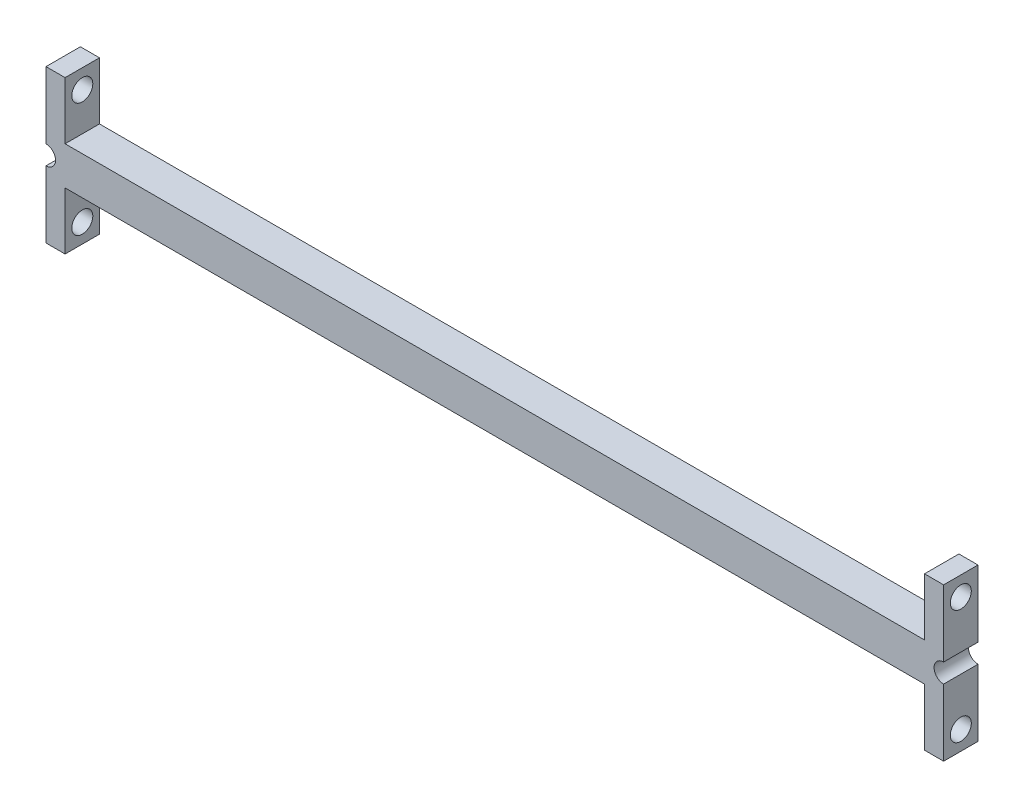
ISO-10303-21;
HEADER;
FILE_DESCRIPTION(('STEP AP214'),'2;1');
FILE_NAME('part.step','',(''),(''),'','','');
FILE_SCHEMA(('AUTOMOTIVE_DESIGN { 1 0 10303 214 1 1 1 1 }'));
ENDSEC;
DATA;
#1=APPLICATION_CONTEXT('core data for automotive mechanical design processes');
#2=APPLICATION_PROTOCOL_DEFINITION('international standard','automotive_design',2000,#1);
#3=PRODUCT_CONTEXT('',#1,'mechanical');
#4=PRODUCT('Part','Part','',(#3));
#5=PRODUCT_RELATED_PRODUCT_CATEGORY('part','',(#4));
#6=PRODUCT_DEFINITION_FORMATION('','',#4);
#7=PRODUCT_DEFINITION_CONTEXT('part definition',#1,'design');
#8=PRODUCT_DEFINITION('design','',#6,#7);
#9=PRODUCT_DEFINITION_SHAPE('','',#8);
#10=(LENGTH_UNIT() NAMED_UNIT(*) SI_UNIT(.MILLI.,.METRE.));
#11=(NAMED_UNIT(*) PLANE_ANGLE_UNIT() SI_UNIT($,.RADIAN.));
#12=(NAMED_UNIT(*) SI_UNIT($,.STERADIAN.) SOLID_ANGLE_UNIT());
#13=UNCERTAINTY_MEASURE_WITH_UNIT(LENGTH_MEASURE(1.E-05),#10,'distance_accuracy_value','');
#14=(GEOMETRIC_REPRESENTATION_CONTEXT(3) GLOBAL_UNCERTAINTY_ASSIGNED_CONTEXT((#13)) GLOBAL_UNIT_ASSIGNED_CONTEXT((#10,
#11,#12)) REPRESENTATION_CONTEXT('',''));
#15=CARTESIAN_POINT('',(0.,0.,0.));
#16=DIRECTION('',(0.,0.,1.));
#17=DIRECTION('',(1.,0.,0.));
#18=AXIS2_PLACEMENT_3D('',#15,#16,#17);
#19=CARTESIAN_POINT('',(0.,0.,9.));
#20=DIRECTION('',(1.,0.,0.));
#21=DIRECTION('',(0.,1.,0.));
#22=AXIS2_PLACEMENT_3D('',#19,#20,#21);
#23=PLANE('',#22);
#24=CARTESIAN_POINT('',(0.,10.,4.5));
#25=DIRECTION('',(-1.,0.,0.));
#26=DIRECTION('',(0.,-1.,0.));
#27=AXIS2_PLACEMENT_3D('',#24,#25,#26);
#28=CIRCLE('',#27,2.75);
#29=CARTESIAN_POINT('',(0.,7.25,4.5));
#30=VERTEX_POINT('',#29);
#31=EDGE_CURVE('E204',#30,#30,#28,.T.);
#32=ORIENTED_EDGE('',*,*,#31,.F.);
#33=EDGE_LOOP('',(#32));
#34=FACE_BOUND('',#33,.T.);
#35=DIRECTION('',(0.,-1.,0.));
#36=VECTOR('',#35,1.);
#37=CARTESIAN_POINT('',(0.,0.,0.));
#38=LINE('',#37,#36);
#39=CARTESIAN_POINT('',(0.,15.,0.));
#40=VERTEX_POINT('',#39);
#41=CARTESIAN_POINT('',(0.,-2.5,0.));
#42=VERTEX_POINT('',#41);
#43=EDGE_CURVE('E161',#40,#42,#38,.T.);
#44=ORIENTED_EDGE('',*,*,#43,.T.);
#45=DIRECTION('',(0.,0.,1.));
#46=VECTOR('',#45,1.);
#47=CARTESIAN_POINT('',(0.,-2.5,-23.));
#48=LINE('',#47,#46);
#49=CARTESIAN_POINT('',(0.,-2.5,9.));
#50=VERTEX_POINT('',#49);
#51=EDGE_CURVE('E58',#42,#50,#48,.T.);
#52=ORIENTED_EDGE('',*,*,#51,.T.);
#53=DIRECTION('',(0.,-1.,0.));
#54=VECTOR('',#53,1.);
#55=CARTESIAN_POINT('',(0.,0.,9.));
#56=LINE('',#55,#54);
#57=CARTESIAN_POINT('',(0.,15.,9.));
#58=VERTEX_POINT('',#57);
#59=EDGE_CURVE('E159',#58,#50,#56,.T.);
#60=ORIENTED_EDGE('',*,*,#59,.F.);
#61=DIRECTION('',(0.,0.,1.));
#62=VECTOR('',#61,1.);
#63=CARTESIAN_POINT('',(0.,15.,0.));
#64=LINE('',#63,#62);
#65=EDGE_CURVE('E241',#40,#58,#64,.T.);
#66=ORIENTED_EDGE('',*,*,#65,.F.);
#67=EDGE_LOOP('',(#44,#52,#60,#66));
#68=FACE_BOUND('',#67,.T.);
#69=ADVANCED_FACE('F34',(#34,#68),#23,.F.);
#70=CARTESIAN_POINT('',(235.,0.,9.));
#71=DIRECTION('',(-1.,0.,0.));
#72=DIRECTION('',(0.,0.,1.));
#73=AXIS2_PLACEMENT_3D('',#70,#71,#72);
#74=PLANE('',#73);
#75=CARTESIAN_POINT('',(235.,-20.,4.5));
#76=DIRECTION('',(-1.,0.,0.));
#77=DIRECTION('',(0.,-1.,0.));
#78=AXIS2_PLACEMENT_3D('',#75,#76,#77);
#79=CIRCLE('',#78,2.75);
#80=CARTESIAN_POINT('',(235.,-22.75,4.5));
#81=VERTEX_POINT('',#80);
#82=EDGE_CURVE('E214',#81,#81,#79,.T.);
#83=ORIENTED_EDGE('',*,*,#82,.T.);
#84=EDGE_LOOP('',(#83));
#85=FACE_BOUND('',#84,.T.);
#86=DIRECTION('',(0.,1.,0.));
#87=VECTOR('',#86,1.);
#88=CARTESIAN_POINT('',(235.,0.,0.));
#89=LINE('',#88,#87);
#90=CARTESIAN_POINT('',(235.,-25.,0.));
#91=VERTEX_POINT('',#90);
#92=CARTESIAN_POINT('',(235.,-7.49999999999999,0.));
#93=VERTEX_POINT('',#92);
#94=EDGE_CURVE('E190',#91,#93,#89,.T.);
#95=ORIENTED_EDGE('',*,*,#94,.T.);
#96=DIRECTION('',(0.,0.,1.));
#97=VECTOR('',#96,1.);
#98=CARTESIAN_POINT('',(235.,-7.49999999999999,-23.));
#99=LINE('',#98,#97);
#100=CARTESIAN_POINT('',(235.,-7.49999999999999,9.));
#101=VERTEX_POINT('',#100);
#102=EDGE_CURVE('E51',#93,#101,#99,.T.);
#103=ORIENTED_EDGE('',*,*,#102,.T.);
#104=DIRECTION('',(0.,1.,0.));
#105=VECTOR('',#104,1.);
#106=CARTESIAN_POINT('',(235.,0.,9.));
#107=LINE('',#106,#105);
#108=CARTESIAN_POINT('',(235.,-25.,9.));
#109=VERTEX_POINT('',#108);
#110=EDGE_CURVE('E179',#109,#101,#107,.T.);
#111=ORIENTED_EDGE('',*,*,#110,.F.);
#112=DIRECTION('',(0.,0.,1.));
#113=VECTOR('',#112,1.);
#114=CARTESIAN_POINT('',(235.,-25.,0.));
#115=LINE('',#114,#113);
#116=EDGE_CURVE('E281',#91,#109,#115,.T.);
#117=ORIENTED_EDGE('',*,*,#116,.F.);
#118=EDGE_LOOP('',(#95,#103,#111,#117));
#119=FACE_BOUND('',#118,.T.);
#120=ADVANCED_FACE('F323',(#85,#119),#74,.F.);
#121=CARTESIAN_POINT('',(0.,-20.,4.5));
#122=DIRECTION('',(-1.,0.,0.));
#123=DIRECTION('',(0.,-1.,0.));
#124=AXIS2_PLACEMENT_3D('',#121,#122,#123);
#125=CIRCLE('',#124,2.75);
#126=CARTESIAN_POINT('',(0.,-22.75,4.5));
#127=VERTEX_POINT('',#126);
#128=EDGE_CURVE('E209',#127,#127,#125,.T.);
#129=ORIENTED_EDGE('',*,*,#128,.F.);
#130=EDGE_LOOP('',(#129));
#131=FACE_BOUND('',#130,.T.);
#132=CARTESIAN_POINT('',(0.,-7.5,9.));
#133=VERTEX_POINT('',#132);
#134=CARTESIAN_POINT('',(0.,-25.,9.));
#135=VERTEX_POINT('',#134);
#136=EDGE_CURVE('E170',#133,#135,#56,.T.);
#137=ORIENTED_EDGE('',*,*,#136,.F.);
#138=DIRECTION('',(0.,0.,1.));
#139=VECTOR('',#138,1.);
#140=CARTESIAN_POINT('',(0.,-7.5,-23.));
#141=LINE('',#140,#139);
#142=CARTESIAN_POINT('',(0.,-7.5,0.));
#143=VERTEX_POINT('',#142);
#144=EDGE_CURVE('E149',#133,#143,#141,.F.);
#145=ORIENTED_EDGE('',*,*,#144,.T.);
#146=CARTESIAN_POINT('',(0.,-25.,0.));
#147=VERTEX_POINT('',#146);
#148=EDGE_CURVE('E187',#143,#147,#38,.T.);
#149=ORIENTED_EDGE('',*,*,#148,.T.);
#150=DIRECTION('',(0.,0.,1.));
#151=VECTOR('',#150,1.);
#152=CARTESIAN_POINT('',(0.,-25.,0.));
#153=LINE('',#152,#151);
#154=EDGE_CURVE('E234',#147,#135,#153,.T.);
#155=ORIENTED_EDGE('',*,*,#154,.T.);
#156=EDGE_LOOP('',(#137,#145,#149,#155));
#157=FACE_BOUND('',#156,.T.);
#158=ADVANCED_FACE('F36',(#131,#157),#23,.F.);
#159=CARTESIAN_POINT('',(0.,-10.,9.));
#160=DIRECTION('',(0.,1.,0.));
#161=DIRECTION('',(-1.,0.,0.));
#162=AXIS2_PLACEMENT_3D('',#159,#160,#161);
#163=PLANE('',#162);
#164=DIRECTION('',(1.,0.,0.));
#165=VECTOR('',#164,1.);
#166=CARTESIAN_POINT('',(0.,-10.,9.));
#167=LINE('',#166,#165);
#168=CARTESIAN_POINT('',(5.,-10.,9.));
#169=VERTEX_POINT('',#168);
#170=CARTESIAN_POINT('',(230.,-10.,9.));
#171=VERTEX_POINT('',#170);
#172=EDGE_CURVE('E169',#169,#171,#167,.T.);
#173=ORIENTED_EDGE('',*,*,#172,.F.);
#174=DIRECTION('',(0.,0.,-1.));
#175=VECTOR('',#174,1.);
#176=CARTESIAN_POINT('',(5.,-10.,9.));
#177=LINE('',#176,#175);
#178=CARTESIAN_POINT('',(5.,-10.,0.));
#179=VERTEX_POINT('',#178);
#180=EDGE_CURVE('E253',#169,#179,#177,.T.);
#181=ORIENTED_EDGE('',*,*,#180,.T.);
#182=DIRECTION('',(1.,0.,0.));
#183=VECTOR('',#182,1.);
#184=CARTESIAN_POINT('',(0.,-10.,0.));
#185=LINE('',#184,#183);
#186=CARTESIAN_POINT('',(230.,-10.,0.));
#187=VERTEX_POINT('',#186);
#188=EDGE_CURVE('E186',#179,#187,#185,.T.);
#189=ORIENTED_EDGE('',*,*,#188,.T.);
#190=DIRECTION('',(0.,0.,1.));
#191=VECTOR('',#190,1.);
#192=CARTESIAN_POINT('',(230.,-10.,9.));
#193=LINE('',#192,#191);
#194=EDGE_CURVE('E176',#187,#171,#193,.T.);
#195=ORIENTED_EDGE('',*,*,#194,.T.);
#196=EDGE_LOOP('',(#173,#181,#189,#195));
#197=FACE_BOUND('',#196,.T.);
#198=ADVANCED_FACE('F311',(#197),#163,.F.);
#199=CARTESIAN_POINT('',(235.,10.,4.5));
#200=DIRECTION('',(-1.,0.,0.));
#201=DIRECTION('',(0.,-1.,0.));
#202=AXIS2_PLACEMENT_3D('',#199,#200,#201);
#203=CIRCLE('',#202,2.75);
#204=CARTESIAN_POINT('',(235.,7.25000000000003,4.5));
#205=VERTEX_POINT('',#204);
#206=EDGE_CURVE('E198',#205,#205,#203,.T.);
#207=ORIENTED_EDGE('',*,*,#206,.T.);
#208=EDGE_LOOP('',(#207));
#209=FACE_BOUND('',#208,.T.);
#210=CARTESIAN_POINT('',(235.,-2.5,9.));
#211=VERTEX_POINT('',#210);
#212=CARTESIAN_POINT('',(235.,15.,9.));
#213=VERTEX_POINT('',#212);
#214=EDGE_CURVE('E172',#211,#213,#107,.T.);
#215=ORIENTED_EDGE('',*,*,#214,.F.);
#216=DIRECTION('',(0.,0.,1.));
#217=VECTOR('',#216,1.);
#218=CARTESIAN_POINT('',(235.,-2.5,-23.));
#219=LINE('',#218,#217);
#220=CARTESIAN_POINT('',(235.,-2.5,0.));
#221=VERTEX_POINT('',#220);
#222=EDGE_CURVE('E162',#211,#221,#219,.F.);
#223=ORIENTED_EDGE('',*,*,#222,.T.);
#224=CARTESIAN_POINT('',(235.,15.,0.));
#225=VERTEX_POINT('',#224);
#226=EDGE_CURVE('E189',#221,#225,#89,.T.);
#227=ORIENTED_EDGE('',*,*,#226,.T.);
#228=DIRECTION('',(0.,0.,1.));
#229=VECTOR('',#228,1.);
#230=CARTESIAN_POINT('',(235.,15.,0.));
#231=LINE('',#230,#229);
#232=EDGE_CURVE('E278',#225,#213,#231,.T.);
#233=ORIENTED_EDGE('',*,*,#232,.T.);
#234=EDGE_LOOP('',(#215,#223,#227,#233));
#235=FACE_BOUND('',#234,.T.);
#236=ADVANCED_FACE('F327',(#209,#235),#74,.F.);
#237=CARTESIAN_POINT('',(0.,0.,9.));
#238=DIRECTION('',(0.,-1.,0.));
#239=DIRECTION('',(0.,0.,-1.));
#240=AXIS2_PLACEMENT_3D('',#237,#238,#239);
#241=PLANE('',#240);
#242=DIRECTION('',(-1.,0.,0.));
#243=VECTOR('',#242,1.);
#244=CARTESIAN_POINT('',(0.,0.,0.));
#245=LINE('',#244,#243);
#246=CARTESIAN_POINT('',(230.,0.,0.));
#247=VERTEX_POINT('',#246);
#248=CARTESIAN_POINT('',(5.,0.,0.));
#249=VERTEX_POINT('',#248);
#250=EDGE_CURVE('E174',#247,#249,#245,.T.);
#251=ORIENTED_EDGE('',*,*,#250,.T.);
#252=DIRECTION('',(0.,0.,1.));
#253=VECTOR('',#252,1.);
#254=CARTESIAN_POINT('',(5.,0.,9.));
#255=LINE('',#254,#253);
#256=CARTESIAN_POINT('',(5.,0.,9.));
#257=VERTEX_POINT('',#256);
#258=EDGE_CURVE('E243',#249,#257,#255,.T.);
#259=ORIENTED_EDGE('',*,*,#258,.T.);
#260=DIRECTION('',(-1.,0.,0.));
#261=VECTOR('',#260,1.);
#262=CARTESIAN_POINT('',(0.,0.,9.));
#263=LINE('',#262,#261);
#264=CARTESIAN_POINT('',(230.,0.,9.));
#265=VERTEX_POINT('',#264);
#266=EDGE_CURVE('E182',#265,#257,#263,.T.);
#267=ORIENTED_EDGE('',*,*,#266,.F.);
#268=DIRECTION('',(0.,0.,-1.));
#269=VECTOR('',#268,1.);
#270=CARTESIAN_POINT('',(230.,0.,9.));
#271=LINE('',#270,#269);
#272=EDGE_CURVE('E277',#265,#247,#271,.T.);
#273=ORIENTED_EDGE('',*,*,#272,.T.);
#274=EDGE_LOOP('',(#251,#259,#267,#273));
#275=FACE_BOUND('',#274,.T.);
#276=ADVANCED_FACE('F336',(#275),#241,.F.);
#277=CARTESIAN_POINT('',(0.,0.,9.));
#278=DIRECTION('',(0.,0.,1.));
#279=DIRECTION('',(1.,0.,0.));
#280=AXIS2_PLACEMENT_3D('',#277,#278,#279);
#281=PLANE('',#280);
#282=CARTESIAN_POINT('',(235.,-5.,9.));
#283=DIRECTION('',(0.,0.,1.));
#284=DIRECTION('',(1.,0.,0.));
#285=AXIS2_PLACEMENT_3D('',#282,#283,#284);
#286=CIRCLE('',#285,2.5);
#287=EDGE_CURVE('E153',#211,#101,#286,.T.);
#288=ORIENTED_EDGE('',*,*,#287,.F.);
#289=ORIENTED_EDGE('',*,*,#214,.T.);
#290=DIRECTION('',(-1.,0.,0.));
#291=VECTOR('',#290,1.);
#292=CARTESIAN_POINT('',(230.,15.,9.));
#293=LINE('',#292,#291);
#294=CARTESIAN_POINT('',(230.,15.,9.));
#295=VERTEX_POINT('',#294);
#296=EDGE_CURVE('E272',#213,#295,#293,.T.);
#297=ORIENTED_EDGE('',*,*,#296,.T.);
#298=DIRECTION('',(0.,-1.,0.));
#299=VECTOR('',#298,1.);
#300=CARTESIAN_POINT('',(230.,15.,9.));
#301=LINE('',#300,#299);
#302=EDGE_CURVE('E267',#295,#265,#301,.T.);
#303=ORIENTED_EDGE('',*,*,#302,.T.);
#304=ORIENTED_EDGE('',*,*,#266,.T.);
#305=DIRECTION('',(0.,1.,0.));
#306=VECTOR('',#305,1.);
#307=CARTESIAN_POINT('',(5.,15.,9.));
#308=LINE('',#307,#306);
#309=CARTESIAN_POINT('',(5.,15.,9.));
#310=VERTEX_POINT('',#309);
#311=EDGE_CURVE('E237',#257,#310,#308,.T.);
#312=ORIENTED_EDGE('',*,*,#311,.T.);
#313=DIRECTION('',(-1.,0.,0.));
#314=VECTOR('',#313,1.);
#315=CARTESIAN_POINT('',(0.,15.,9.));
#316=LINE('',#315,#314);
#317=EDGE_CURVE('E168',#310,#58,#316,.T.);
#318=ORIENTED_EDGE('',*,*,#317,.T.);
#319=ORIENTED_EDGE('',*,*,#59,.T.);
#320=CARTESIAN_POINT('',(0.,-5.,9.));
#321=DIRECTION('',(0.,0.,1.));
#322=DIRECTION('',(1.,0.,0.));
#323=AXIS2_PLACEMENT_3D('',#320,#321,#322);
#324=CIRCLE('',#323,2.5);
#325=EDGE_CURVE('E146',#133,#50,#324,.T.);
#326=ORIENTED_EDGE('',*,*,#325,.F.);
#327=ORIENTED_EDGE('',*,*,#136,.T.);
#328=DIRECTION('',(1.,0.,0.));
#329=VECTOR('',#328,1.);
#330=CARTESIAN_POINT('',(0.,-25.,9.));
#331=LINE('',#330,#329);
#332=CARTESIAN_POINT('',(5.00000000000001,-25.,9.));
#333=VERTEX_POINT('',#332);
#334=EDGE_CURVE('E224',#135,#333,#331,.T.);
#335=ORIENTED_EDGE('',*,*,#334,.T.);
#336=EDGE_CURVE('E238',#333,#169,#308,.T.);
#337=ORIENTED_EDGE('',*,*,#336,.T.);
#338=ORIENTED_EDGE('',*,*,#172,.T.);
#339=CARTESIAN_POINT('',(230.,-25.,9.));
#340=VERTEX_POINT('',#339);
#341=EDGE_CURVE('E256',#171,#340,#301,.T.);
#342=ORIENTED_EDGE('',*,*,#341,.T.);
#343=DIRECTION('',(1.,0.,0.));
#344=VECTOR('',#343,1.);
#345=CARTESIAN_POINT('',(230.,-25.,9.));
#346=LINE('',#345,#344);
#347=EDGE_CURVE('E269',#340,#109,#346,.T.);
#348=ORIENTED_EDGE('',*,*,#347,.T.);
#349=ORIENTED_EDGE('',*,*,#110,.T.);
#350=EDGE_LOOP('',(#288,#289,#297,#303,#304,#312,#318,#319,#326,#327,#335,#337,#338,#342,#348,#349));
#351=FACE_BOUND('',#350,.T.);
#352=ADVANCED_FACE('F166',(#351),#281,.T.);
#353=CARTESIAN_POINT('',(0.,0.,0.));
#354=DIRECTION('',(0.,0.,1.));
#355=DIRECTION('',(1.,0.,0.));
#356=AXIS2_PLACEMENT_3D('',#353,#354,#355);
#357=PLANE('',#356);
#358=ORIENTED_EDGE('',*,*,#226,.F.);
#359=CARTESIAN_POINT('',(235.,-5.,0.));
#360=DIRECTION('',(0.,0.,1.));
#361=DIRECTION('',(1.,0.,0.));
#362=AXIS2_PLACEMENT_3D('',#359,#360,#361);
#363=CIRCLE('',#362,2.5);
#364=EDGE_CURVE('E11',#221,#93,#363,.T.);
#365=ORIENTED_EDGE('',*,*,#364,.T.);
#366=ORIENTED_EDGE('',*,*,#94,.F.);
#367=DIRECTION('',(1.,0.,0.));
#368=VECTOR('',#367,1.);
#369=CARTESIAN_POINT('',(230.,-25.,0.));
#370=LINE('',#369,#368);
#371=CARTESIAN_POINT('',(230.,-25.,0.));
#372=VERTEX_POINT('',#371);
#373=EDGE_CURVE('E259',#372,#91,#370,.T.);
#374=ORIENTED_EDGE('',*,*,#373,.F.);
#375=DIRECTION('',(0.,-1.,0.));
#376=VECTOR('',#375,1.);
#377=CARTESIAN_POINT('',(230.,15.,0.));
#378=LINE('',#377,#376);
#379=EDGE_CURVE('E260',#187,#372,#378,.T.);
#380=ORIENTED_EDGE('',*,*,#379,.F.);
#381=ORIENTED_EDGE('',*,*,#188,.F.);
#382=DIRECTION('',(0.,1.,0.));
#383=VECTOR('',#382,1.);
#384=CARTESIAN_POINT('',(5.,15.,0.));
#385=LINE('',#384,#383);
#386=CARTESIAN_POINT('',(5.00000000000001,-25.,0.));
#387=VERTEX_POINT('',#386);
#388=EDGE_CURVE('E229',#387,#179,#385,.T.);
#389=ORIENTED_EDGE('',*,*,#388,.F.);
#390=DIRECTION('',(1.,0.,0.));
#391=VECTOR('',#390,1.);
#392=CARTESIAN_POINT('',(0.,-25.,0.));
#393=LINE('',#392,#391);
#394=EDGE_CURVE('E225',#147,#387,#393,.T.);
#395=ORIENTED_EDGE('',*,*,#394,.F.);
#396=ORIENTED_EDGE('',*,*,#148,.F.);
#397=CARTESIAN_POINT('',(0.,-5.,0.));
#398=DIRECTION('',(0.,0.,1.));
#399=DIRECTION('',(1.,0.,0.));
#400=AXIS2_PLACEMENT_3D('',#397,#398,#399);
#401=CIRCLE('',#400,2.5);
#402=EDGE_CURVE('E43',#143,#42,#401,.T.);
#403=ORIENTED_EDGE('',*,*,#402,.T.);
#404=ORIENTED_EDGE('',*,*,#43,.F.);
#405=DIRECTION('',(-1.,0.,0.));
#406=VECTOR('',#405,1.);
#407=CARTESIAN_POINT('',(0.,15.,0.));
#408=LINE('',#407,#406);
#409=CARTESIAN_POINT('',(5.,15.,0.));
#410=VERTEX_POINT('',#409);
#411=EDGE_CURVE('E231',#410,#40,#408,.T.);
#412=ORIENTED_EDGE('',*,*,#411,.F.);
#413=EDGE_CURVE('E228',#249,#410,#385,.T.);
#414=ORIENTED_EDGE('',*,*,#413,.F.);
#415=ORIENTED_EDGE('',*,*,#250,.F.);
#416=CARTESIAN_POINT('',(230.,15.,0.));
#417=VERTEX_POINT('',#416);
#418=EDGE_CURVE('E257',#417,#247,#378,.T.);
#419=ORIENTED_EDGE('',*,*,#418,.F.);
#420=DIRECTION('',(-1.,0.,0.));
#421=VECTOR('',#420,1.);
#422=CARTESIAN_POINT('',(230.,15.,0.));
#423=LINE('',#422,#421);
#424=EDGE_CURVE('E263',#225,#417,#423,.T.);
#425=ORIENTED_EDGE('',*,*,#424,.F.);
#426=EDGE_LOOP('',(#358,#365,#366,#374,#380,#381,#389,#395,#396,#403,#404,#412,#414,#415,#419,#425));
#427=FACE_BOUND('',#426,.T.);
#428=ADVANCED_FACE('F304',(#427),#357,.F.);
#429=CARTESIAN_POINT('',(230.,15.,0.));
#430=DIRECTION('',(0.,1.,0.));
#431=DIRECTION('',(0.,0.,1.));
#432=AXIS2_PLACEMENT_3D('',#429,#430,#431);
#433=PLANE('',#432);
#434=ORIENTED_EDGE('',*,*,#296,.F.);
#435=ORIENTED_EDGE('',*,*,#232,.F.);
#436=ORIENTED_EDGE('',*,*,#424,.T.);
#437=DIRECTION('',(0.,0.,1.));
#438=VECTOR('',#437,1.);
#439=CARTESIAN_POINT('',(230.,15.,0.));
#440=LINE('',#439,#438);
#441=EDGE_CURVE('E275',#417,#295,#440,.T.);
#442=ORIENTED_EDGE('',*,*,#441,.T.);
#443=EDGE_LOOP('',(#434,#435,#436,#442));
#444=FACE_BOUND('',#443,.T.);
#445=ADVANCED_FACE('F332',(#444),#433,.T.);
#446=CARTESIAN_POINT('',(230.,15.,0.));
#447=DIRECTION('',(-1.,0.,0.));
#448=DIRECTION('',(0.,0.,1.));
#449=AXIS2_PLACEMENT_3D('',#446,#447,#448);
#450=PLANE('',#449);
#451=CARTESIAN_POINT('',(230.,10.,4.5));
#452=DIRECTION('',(-1.,0.,0.));
#453=DIRECTION('',(0.,0.,1.));
#454=AXIS2_PLACEMENT_3D('',#451,#452,#453);
#455=CIRCLE('',#454,2.75);
#456=CARTESIAN_POINT('',(230.,7.25000000000003,4.5));
#457=VERTEX_POINT('',#456);
#458=EDGE_CURVE('E154',#457,#457,#455,.T.);
#459=ORIENTED_EDGE('',*,*,#458,.F.);
#460=EDGE_LOOP('',(#459));
#461=FACE_BOUND('',#460,.T.);
#462=ORIENTED_EDGE('',*,*,#272,.F.);
#463=ORIENTED_EDGE('',*,*,#302,.F.);
#464=ORIENTED_EDGE('',*,*,#441,.F.);
#465=ORIENTED_EDGE('',*,*,#418,.T.);
#466=EDGE_LOOP('',(#462,#463,#464,#465));
#467=FACE_BOUND('',#466,.T.);
#468=ADVANCED_FACE('F335',(#461,#467),#450,.T.);
#469=CARTESIAN_POINT('',(230.,-20.,4.5));
#470=DIRECTION('',(-1.,0.,0.));
#471=DIRECTION('',(0.,0.,1.));
#472=AXIS2_PLACEMENT_3D('',#469,#470,#471);
#473=CIRCLE('',#472,2.75);
#474=CARTESIAN_POINT('',(230.,-22.75,4.5));
#475=VERTEX_POINT('',#474);
#476=EDGE_CURVE('E197',#475,#475,#473,.T.);
#477=ORIENTED_EDGE('',*,*,#476,.F.);
#478=EDGE_LOOP('',(#477));
#479=FACE_BOUND('',#478,.T.);
#480=ORIENTED_EDGE('',*,*,#194,.F.);
#481=ORIENTED_EDGE('',*,*,#379,.T.);
#482=DIRECTION('',(0.,0.,1.));
#483=VECTOR('',#482,1.);
#484=CARTESIAN_POINT('',(230.,-25.,0.));
#485=LINE('',#484,#483);
#486=EDGE_CURVE('E266',#372,#340,#485,.T.);
#487=ORIENTED_EDGE('',*,*,#486,.T.);
#488=ORIENTED_EDGE('',*,*,#341,.F.);
#489=EDGE_LOOP('',(#480,#481,#487,#488));
#490=FACE_BOUND('',#489,.T.);
#491=ADVANCED_FACE('F314',(#479,#490),#450,.T.);
#492=CARTESIAN_POINT('',(230.,-25.,0.));
#493=DIRECTION('',(0.,-1.,0.));
#494=DIRECTION('',(0.,0.,-1.));
#495=AXIS2_PLACEMENT_3D('',#492,#493,#494);
#496=PLANE('',#495);
#497=ORIENTED_EDGE('',*,*,#347,.F.);
#498=ORIENTED_EDGE('',*,*,#486,.F.);
#499=ORIENTED_EDGE('',*,*,#373,.T.);
#500=ORIENTED_EDGE('',*,*,#116,.T.);
#501=EDGE_LOOP('',(#497,#498,#499,#500));
#502=FACE_BOUND('',#501,.T.);
#503=ADVANCED_FACE('F319',(#502),#496,.T.);
#504=CARTESIAN_POINT('',(0.,15.,0.));
#505=DIRECTION('',(0.,1.,0.));
#506=DIRECTION('',(0.,0.,1.));
#507=AXIS2_PLACEMENT_3D('',#504,#505,#506);
#508=PLANE('',#507);
#509=ORIENTED_EDGE('',*,*,#317,.F.);
#510=DIRECTION('',(0.,0.,1.));
#511=VECTOR('',#510,1.);
#512=CARTESIAN_POINT('',(5.,15.,0.));
#513=LINE('',#512,#511);
#514=EDGE_CURVE('E244',#410,#310,#513,.T.);
#515=ORIENTED_EDGE('',*,*,#514,.F.);
#516=ORIENTED_EDGE('',*,*,#411,.T.);
#517=ORIENTED_EDGE('',*,*,#65,.T.);
#518=EDGE_LOOP('',(#509,#515,#516,#517));
#519=FACE_BOUND('',#518,.T.);
#520=ADVANCED_FACE('F343',(#519),#508,.T.);
#521=CARTESIAN_POINT('',(5.,15.,0.));
#522=DIRECTION('',(1.,0.,0.));
#523=DIRECTION('',(0.,1.,0.));
#524=AXIS2_PLACEMENT_3D('',#521,#522,#523);
#525=PLANE('',#524);
#526=CARTESIAN_POINT('',(5.,10.,4.5));
#527=DIRECTION('',(1.,0.,0.));
#528=DIRECTION('',(0.,1.,0.));
#529=AXIS2_PLACEMENT_3D('',#526,#527,#528);
#530=CIRCLE('',#529,2.75);
#531=CARTESIAN_POINT('',(5.00000000000003,7.25,4.5));
#532=VERTEX_POINT('',#531);
#533=EDGE_CURVE('E38',#532,#532,#530,.T.);
#534=ORIENTED_EDGE('',*,*,#533,.F.);
#535=EDGE_LOOP('',(#534));
#536=FACE_BOUND('',#535,.T.);
#537=ORIENTED_EDGE('',*,*,#258,.F.);
#538=ORIENTED_EDGE('',*,*,#413,.T.);
#539=ORIENTED_EDGE('',*,*,#514,.T.);
#540=ORIENTED_EDGE('',*,*,#311,.F.);
#541=EDGE_LOOP('',(#537,#538,#539,#540));
#542=FACE_BOUND('',#541,.T.);
#543=ADVANCED_FACE('F339',(#536,#542),#525,.T.);
#544=CARTESIAN_POINT('',(5.,-20.,4.5));
#545=DIRECTION('',(1.,0.,0.));
#546=DIRECTION('',(0.,1.,0.));
#547=AXIS2_PLACEMENT_3D('',#544,#545,#546);
#548=CIRCLE('',#547,2.75);
#549=CARTESIAN_POINT('',(5.00000000000003,-22.75,4.5));
#550=VERTEX_POINT('',#549);
#551=EDGE_CURVE('E195',#550,#550,#548,.T.);
#552=ORIENTED_EDGE('',*,*,#551,.F.);
#553=EDGE_LOOP('',(#552));
#554=FACE_BOUND('',#553,.T.);
#555=ORIENTED_EDGE('',*,*,#180,.F.);
#556=ORIENTED_EDGE('',*,*,#336,.F.);
#557=DIRECTION('',(0.,0.,1.));
#558=VECTOR('',#557,1.);
#559=CARTESIAN_POINT('',(5.00000000000001,-25.,0.));
#560=LINE('',#559,#558);
#561=EDGE_CURVE('E247',#387,#333,#560,.T.);
#562=ORIENTED_EDGE('',*,*,#561,.F.);
#563=ORIENTED_EDGE('',*,*,#388,.T.);
#564=EDGE_LOOP('',(#555,#556,#562,#563));
#565=FACE_BOUND('',#564,.T.);
#566=ADVANCED_FACE('F309',(#554,#565),#525,.T.);
#567=CARTESIAN_POINT('',(0.,-25.,0.));
#568=DIRECTION('',(0.,-1.,0.));
#569=DIRECTION('',(0.,0.,-1.));
#570=AXIS2_PLACEMENT_3D('',#567,#568,#569);
#571=PLANE('',#570);
#572=ORIENTED_EDGE('',*,*,#334,.F.);
#573=ORIENTED_EDGE('',*,*,#154,.F.);
#574=ORIENTED_EDGE('',*,*,#394,.T.);
#575=ORIENTED_EDGE('',*,*,#561,.T.);
#576=EDGE_LOOP('',(#572,#573,#574,#575));
#577=FACE_BOUND('',#576,.T.);
#578=ADVANCED_FACE('F301',(#577),#571,.T.);
#579=CARTESIAN_POINT('',(0.,-5.,-23.));
#580=DIRECTION('',(0.,0.,1.));
#581=DIRECTION('',(1.,0.,0.));
#582=AXIS2_PLACEMENT_3D('',#579,#580,#581);
#583=CYLINDRICAL_SURFACE('',#582,2.5);
#584=ORIENTED_EDGE('',*,*,#402,.F.);
#585=ORIENTED_EDGE('',*,*,#144,.F.);
#586=ORIENTED_EDGE('',*,*,#325,.T.);
#587=ORIENTED_EDGE('',*,*,#51,.F.);
#588=EDGE_LOOP('',(#584,#585,#586,#587));
#589=FACE_BOUND('',#588,.T.);
#590=ADVANCED_FACE('F147',(#589),#583,.F.);
#591=CARTESIAN_POINT('',(235.,-5.,-23.));
#592=DIRECTION('',(0.,0.,1.));
#593=DIRECTION('',(1.,0.,0.));
#594=AXIS2_PLACEMENT_3D('',#591,#592,#593);
#595=CYLINDRICAL_SURFACE('',#594,2.5);
#596=ORIENTED_EDGE('',*,*,#364,.F.);
#597=ORIENTED_EDGE('',*,*,#222,.F.);
#598=ORIENTED_EDGE('',*,*,#287,.T.);
#599=ORIENTED_EDGE('',*,*,#102,.F.);
#600=EDGE_LOOP('',(#596,#597,#598,#599));
#601=FACE_BOUND('',#600,.T.);
#602=ADVANCED_FACE('F325',(#601),#595,.F.);
#603=CARTESIAN_POINT('',(235.,-20.,4.5));
#604=DIRECTION('',(-1.,0.,0.));
#605=DIRECTION('',(0.,-1.,0.));
#606=AXIS2_PLACEMENT_3D('',#603,#604,#605);
#607=CYLINDRICAL_SURFACE('',#606,2.75);
#608=CARTESIAN_POINT('',(5.00000000000003,-22.75,4.5));
#609=CARTESIAN_POINT('',(4.9479166666667,-22.75,4.5));
#610=CARTESIAN_POINT('',(4.89583333333337,-22.75,4.5));
#611=CARTESIAN_POINT('',(4.7916666666667,-22.75,4.5));
#612=CARTESIAN_POINT('',(4.73958333333337,-22.75,4.5));
#613=CARTESIAN_POINT('',(4.63541666666671,-22.75,4.5));
#614=CARTESIAN_POINT('',(4.58333333333337,-22.75,4.5));
#615=CARTESIAN_POINT('',(4.47916666666671,-22.75,4.5));
#616=CARTESIAN_POINT('',(4.42708333333338,-22.75,4.5));
#617=CARTESIAN_POINT('',(4.3229166666667,-22.75,4.5));
#618=CARTESIAN_POINT('',(4.27083333333336,-22.75,4.5));
#619=CARTESIAN_POINT('',(4.16666666666669,-22.75,4.5));
#620=CARTESIAN_POINT('',(4.11458333333336,-22.75,4.5));
#621=CARTESIAN_POINT('',(4.01041666666669,-22.75,4.5));
#622=CARTESIAN_POINT('',(3.95833333333336,-22.75,4.5));
#623=CARTESIAN_POINT('',(3.8541666666667,-22.75,4.5));
#624=CARTESIAN_POINT('',(3.80208333333336,-22.75,4.5));
#625=CARTESIAN_POINT('',(3.6979166666667,-22.75,4.5));
#626=CARTESIAN_POINT('',(3.64583333333337,-22.75,4.5));
#627=CARTESIAN_POINT('',(3.5416666666667,-22.75,4.5));
#628=CARTESIAN_POINT('',(3.48958333333337,-22.75,4.5));
#629=CARTESIAN_POINT('',(3.38541666666671,-22.75,4.5));
#630=CARTESIAN_POINT('',(3.33333333333337,-22.75,4.5));
#631=CARTESIAN_POINT('',(3.2291666666667,-22.75,4.5));
#632=CARTESIAN_POINT('',(3.17708333333336,-22.75,4.5));
#633=CARTESIAN_POINT('',(3.07291666666668,-22.75,4.5));
#634=CARTESIAN_POINT('',(3.02083333333335,-22.75,4.5));
#635=CARTESIAN_POINT('',(2.91666666666669,-22.75,4.5));
#636=CARTESIAN_POINT('',(2.86458333333336,-22.75,4.5));
#637=CARTESIAN_POINT('',(2.76041666666669,-22.75,4.5));
#638=CARTESIAN_POINT('',(2.70833333333336,-22.75,4.5));
#639=CARTESIAN_POINT('',(2.60416666666669,-22.75,4.5));
#640=CARTESIAN_POINT('',(2.55208333333336,-22.75,4.5));
#641=CARTESIAN_POINT('',(2.4479166666667,-22.75,4.5));
#642=CARTESIAN_POINT('',(2.39583333333337,-22.75,4.5));
#643=CARTESIAN_POINT('',(2.2916666666667,-22.75,4.5));
#644=CARTESIAN_POINT('',(2.23958333333337,-22.75,4.5));
#645=CARTESIAN_POINT('',(2.1354166666667,-22.75,4.5));
#646=CARTESIAN_POINT('',(2.08333333333337,-22.75,4.5));
#647=CARTESIAN_POINT('',(1.97916666666671,-22.75,4.5));
#648=CARTESIAN_POINT('',(1.92708333333338,-22.75,4.5));
#649=CARTESIAN_POINT('',(1.8229166666667,-22.75,4.5));
#650=CARTESIAN_POINT('',(1.77083333333336,-22.75,4.5));
#651=CARTESIAN_POINT('',(1.66666666666669,-22.75,4.5));
#652=CARTESIAN_POINT('',(1.61458333333335,-22.75,4.5));
#653=CARTESIAN_POINT('',(1.51041666666669,-22.75,4.5));
#654=CARTESIAN_POINT('',(1.45833333333336,-22.75,4.5));
#655=CARTESIAN_POINT('',(1.35416666666669,-22.75,4.5));
#656=CARTESIAN_POINT('',(1.30208333333336,-22.75,4.5));
#657=CARTESIAN_POINT('',(1.1979166666667,-22.75,4.5));
#658=CARTESIAN_POINT('',(1.14583333333336,-22.75,4.5));
#659=CARTESIAN_POINT('',(1.0416666666667,-22.75,4.5));
#660=CARTESIAN_POINT('',(0.989583333333368,-22.75,4.5));
#661=CARTESIAN_POINT('',(0.885416666666703,-22.75,4.5));
#662=CARTESIAN_POINT('',(0.833333333333371,-22.75,4.5));
#663=CARTESIAN_POINT('',(0.729166666666697,-22.75,4.5));
#664=CARTESIAN_POINT('',(0.677083333333356,-22.75,4.5));
#665=CARTESIAN_POINT('',(0.572916666666682,-22.75,4.5));
#666=CARTESIAN_POINT('',(0.52083333333335,-22.75,4.5));
#667=CARTESIAN_POINT('',(0.416666666666686,-22.75,4.5));
#668=CARTESIAN_POINT('',(0.364583333333353,-22.75,4.5));
#669=CARTESIAN_POINT('',(0.260416666666689,-22.75,4.5));
#670=CARTESIAN_POINT('',(0.208333333333357,-22.75,4.5));
#671=CARTESIAN_POINT('',(0.104166666666692,-22.75,4.5));
#672=CARTESIAN_POINT('',(0.05208333333336,-22.75,4.5));
#673=CARTESIAN_POINT('',(0.,-22.75,4.5));
#674=B_SPLINE_CURVE_WITH_KNOTS('',3,(#608,#609,#610,#611,#612,#613,#614,#615,#616,#617,#618,
#619,#620,#621,#622,#623,#624,#625,#626,#627,#628,#629,#630,#631,#632,#633,#634,#635,#636,#637,
#638,#639,#640,#641,#642,#643,#644,#645,#646,#647,#648,#649,#650,#651,#652,#653,#654,#655,#656,
#657,#658,#659,#660,#661,#662,#663,#664,#665,#666,#667,#668,#669,#670,#671,#672,#673),
.UNSPECIFIED.,.F.,.F.,(4,2,2,2,2,2,2,2,2,2,2,2,2,2,2,2,2,2,2,2,2,2,2,2,2,2,2,2,2,2,2,2,4),(0.,
0.156249999999997,0.312499999999993,0.46874999999999,0.624999999999987,0.781250000000011,
0.937500000000008,1.09375,1.25,1.40625,1.56249999999999,1.71874999999999,1.87500000000002,
2.03125000000001,2.18750000000001,2.34375000000001,2.5,2.65625,2.8125,2.96874999999999,
3.12499999999999,3.28125000000001,3.43750000000001,3.59375000000001,3.75,3.90625,4.0625,
4.21874999999999,4.37500000000002,4.53125000000001,4.68750000000001,4.84375000000001,5.),.UNSPECIFIED.);
#675=EDGE_CURVE('BSEAM369',#550,#127,#674,.T.);
#676=ORIENTED_EDGE('',*,*,#551,.T.);
#677=ORIENTED_EDGE('',*,*,#128,.T.);
#678=ORIENTED_EDGE('',*,*,#675,.T.);
#679=ORIENTED_EDGE('',*,*,#675,.F.);
#680=EDGE_LOOP('',(#676,#678,#677,#679));
#681=FACE_BOUND('',#680,.T.);
#682=ADVANCED_FACE('F369',(#681),#607,.F.);
#683=CARTESIAN_POINT('',(235.,10.,4.5));
#684=DIRECTION('',(-1.,0.,0.));
#685=DIRECTION('',(0.,-1.,0.));
#686=AXIS2_PLACEMENT_3D('',#683,#684,#685);
#687=CYLINDRICAL_SURFACE('',#686,2.75);
#688=CARTESIAN_POINT('',(5.00000000000003,7.25,4.5));
#689=CARTESIAN_POINT('',(4.9479166666667,7.25,4.5));
#690=CARTESIAN_POINT('',(4.89583333333337,7.25,4.5));
#691=CARTESIAN_POINT('',(4.7916666666667,7.25,4.5));
#692=CARTESIAN_POINT('',(4.73958333333337,7.25,4.5));
#693=CARTESIAN_POINT('',(4.6354166666667,7.25,4.5));
#694=CARTESIAN_POINT('',(4.58333333333336,7.25,4.5));
#695=CARTESIAN_POINT('',(4.47916666666668,7.25,4.5));
#696=CARTESIAN_POINT('',(4.42708333333335,7.25,4.5));
#697=CARTESIAN_POINT('',(4.32291666666669,7.25,4.5));
#698=CARTESIAN_POINT('',(4.27083333333335,7.25,4.5));
#699=CARTESIAN_POINT('',(4.16666666666669,7.25,4.5));
#700=CARTESIAN_POINT('',(4.11458333333336,7.25,4.5));
#701=CARTESIAN_POINT('',(4.01041666666669,7.25,4.5));
#702=CARTESIAN_POINT('',(3.95833333333336,7.25,4.5));
#703=CARTESIAN_POINT('',(3.85416666666669,7.25,4.5));
#704=CARTESIAN_POINT('',(3.80208333333334,7.25,4.5));
#705=CARTESIAN_POINT('',(3.69791666666667,7.25,4.5));
#706=CARTESIAN_POINT('',(3.64583333333334,7.25,4.5));
#707=CARTESIAN_POINT('',(3.54166666666667,7.25,4.5));
#708=CARTESIAN_POINT('',(3.48958333333334,7.25,4.5));
#709=CARTESIAN_POINT('',(3.38541666666668,7.25,4.5));
#710=CARTESIAN_POINT('',(3.33333333333335,7.25,4.5));
#711=CARTESIAN_POINT('',(3.22916666666668,7.25,4.5));
#712=CARTESIAN_POINT('',(3.17708333333335,7.25,4.5));
#713=CARTESIAN_POINT('',(3.07291666666668,7.25,4.5));
#714=CARTESIAN_POINT('',(3.02083333333335,7.25,4.5));
#715=CARTESIAN_POINT('',(2.91666666666668,7.25,4.5));
#716=CARTESIAN_POINT('',(2.86458333333334,7.25,4.5));
#717=CARTESIAN_POINT('',(2.76041666666666,7.25,4.5));
#718=CARTESIAN_POINT('',(2.70833333333333,7.25,4.5));
#719=CARTESIAN_POINT('',(2.60416666666667,7.25,4.5));
#720=CARTESIAN_POINT('',(2.55208333333333,7.25,4.5));
#721=CARTESIAN_POINT('',(2.44791666666667,7.25,4.5));
#722=CARTESIAN_POINT('',(2.39583333333334,7.25,4.5));
#723=CARTESIAN_POINT('',(2.29166666666667,7.25,4.5));
#724=CARTESIAN_POINT('',(2.23958333333334,7.25,4.5));
#725=CARTESIAN_POINT('',(2.13541666666667,7.25,4.5));
#726=CARTESIAN_POINT('',(2.08333333333333,7.25,4.5));
#727=CARTESIAN_POINT('',(1.97916666666665,7.25,4.5));
#728=CARTESIAN_POINT('',(1.92708333333332,7.25,4.5));
#729=CARTESIAN_POINT('',(1.82291666666666,7.25,4.5));
#730=CARTESIAN_POINT('',(1.77083333333332,7.25,4.5));
#731=CARTESIAN_POINT('',(1.66666666666666,7.25,4.5));
#732=CARTESIAN_POINT('',(1.61458333333333,7.25,4.5));
#733=CARTESIAN_POINT('',(1.51041666666666,7.25,4.5));
#734=CARTESIAN_POINT('',(1.45833333333333,7.25,4.5));
#735=CARTESIAN_POINT('',(1.35416666666667,7.25,4.5));
#736=CARTESIAN_POINT('',(1.30208333333333,7.25,4.5));
#737=CARTESIAN_POINT('',(1.19791666666666,7.25,4.5));
#738=CARTESIAN_POINT('',(1.14583333333332,7.25,4.5));
#739=CARTESIAN_POINT('',(1.04166666666664,7.25,4.5));
#740=CARTESIAN_POINT('',(0.989583333333312,7.25,4.5));
#741=CARTESIAN_POINT('',(0.885416666666648,7.25,4.5));
#742=CARTESIAN_POINT('',(0.833333333333316,7.25,4.5));
#743=CARTESIAN_POINT('',(0.729166666666651,7.25,4.5));
#744=CARTESIAN_POINT('',(0.677083333333319,7.25,4.5));
#745=CARTESIAN_POINT('',(0.572916666666654,7.25,4.5));
#746=CARTESIAN_POINT('',(0.520833333333322,7.25,4.5));
#747=CARTESIAN_POINT('',(0.416666666666649,7.25,4.5));
#748=CARTESIAN_POINT('',(0.364583333333307,7.25,4.5));
#749=CARTESIAN_POINT('',(0.260416666666633,7.25,4.5));
#750=CARTESIAN_POINT('',(0.208333333333301,7.25,4.5));
#751=CARTESIAN_POINT('',(0.104166666666637,7.25,4.5));
#752=CARTESIAN_POINT('',(0.0520833333333044,7.25,4.5));
#753=CARTESIAN_POINT('',(0.,7.25,4.5));
#754=B_SPLINE_CURVE_WITH_KNOTS('',3,(#688,#689,#690,#691,#692,#693,#694,#695,#696,#697,#698,
#699,#700,#701,#702,#703,#704,#705,#706,#707,#708,#709,#710,#711,#712,#713,#714,#715,#716,#717,
#718,#719,#720,#721,#722,#723,#724,#725,#726,#727,#728,#729,#730,#731,#732,#733,#734,#735,#736,
#737,#738,#739,#740,#741,#742,#743,#744,#745,#746,#747,#748,#749,#750,#751,#752,#753),
.UNSPECIFIED.,.F.,.F.,(4,2,2,2,2,2,2,2,2,2,2,2,2,2,2,2,2,2,2,2,2,2,2,2,2,2,2,2,2,2,2,2,4),(0.,
0.156249999999997,0.312499999999993,0.468750000000018,0.625000000000014,0.781250000000011,
0.937500000000008,1.09375,1.25000000000003,1.40625000000003,1.56250000000002,1.71875000000002,
1.87500000000002,2.03125000000001,2.18750000000004,2.34375000000003,2.50000000000003,
2.65625000000003,2.81250000000002,2.96875000000005,3.12500000000004,3.28125000000004,
3.43750000000004,3.59375000000003,3.75000000000003,3.90625000000006,4.06250000000005,
4.21875000000005,4.37500000000005,4.53125000000004,4.68750000000007,4.84375000000006,
5.00000000000006),.UNSPECIFIED.);
#755=EDGE_CURVE('BSEAM371',#532,#30,#754,.T.);
#756=ORIENTED_EDGE('',*,*,#533,.T.);
#757=ORIENTED_EDGE('',*,*,#31,.T.);
#758=ORIENTED_EDGE('',*,*,#755,.T.);
#759=ORIENTED_EDGE('',*,*,#755,.F.);
#760=EDGE_LOOP('',(#756,#758,#757,#759));
#761=FACE_BOUND('',#760,.T.);
#762=ADVANCED_FACE('F371',(#761),#687,.F.);
#763=CARTESIAN_POINT('',(230.,-22.75,4.5));
#764=CARTESIAN_POINT('',(230.052083333333,-22.75,4.5));
#765=CARTESIAN_POINT('',(230.104166666667,-22.75,4.5));
#766=CARTESIAN_POINT('',(230.208333333333,-22.75,4.5));
#767=CARTESIAN_POINT('',(230.260416666667,-22.75,4.5));
#768=CARTESIAN_POINT('',(230.364583333333,-22.75,4.5));
#769=CARTESIAN_POINT('',(230.416666666667,-22.75,4.5));
#770=CARTESIAN_POINT('',(230.520833333333,-22.75,4.5));
#771=CARTESIAN_POINT('',(230.572916666667,-22.75,4.5));
#772=CARTESIAN_POINT('',(230.677083333333,-22.75,4.5));
#773=CARTESIAN_POINT('',(230.729166666667,-22.75,4.5));
#774=CARTESIAN_POINT('',(230.833333333333,-22.75,4.5));
#775=CARTESIAN_POINT('',(230.885416666667,-22.75,4.5));
#776=CARTESIAN_POINT('',(230.989583333333,-22.75,4.5));
#777=CARTESIAN_POINT('',(231.041666666667,-22.75,4.5));
#778=CARTESIAN_POINT('',(231.145833333333,-22.75,4.5));
#779=CARTESIAN_POINT('',(231.197916666667,-22.75,4.5));
#780=CARTESIAN_POINT('',(231.302083333333,-22.75,4.5));
#781=CARTESIAN_POINT('',(231.354166666667,-22.75,4.5));
#782=CARTESIAN_POINT('',(231.458333333333,-22.75,4.5));
#783=CARTESIAN_POINT('',(231.510416666667,-22.75,4.5));
#784=CARTESIAN_POINT('',(231.614583333333,-22.75,4.5));
#785=CARTESIAN_POINT('',(231.666666666667,-22.75,4.5));
#786=CARTESIAN_POINT('',(231.770833333333,-22.75,4.5));
#787=CARTESIAN_POINT('',(231.822916666667,-22.75,4.5));
#788=CARTESIAN_POINT('',(231.927083333333,-22.75,4.5));
#789=CARTESIAN_POINT('',(231.979166666667,-22.75,4.5));
#790=CARTESIAN_POINT('',(232.083333333333,-22.75,4.5));
#791=CARTESIAN_POINT('',(232.135416666667,-22.75,4.5));
#792=CARTESIAN_POINT('',(232.239583333333,-22.75,4.5));
#793=CARTESIAN_POINT('',(232.291666666667,-22.75,4.5));
#794=CARTESIAN_POINT('',(232.395833333333,-22.75,4.5));
#795=CARTESIAN_POINT('',(232.447916666667,-22.75,4.5));
#796=CARTESIAN_POINT('',(232.552083333333,-22.75,4.5));
#797=CARTESIAN_POINT('',(232.604166666667,-22.75,4.5));
#798=CARTESIAN_POINT('',(232.708333333333,-22.75,4.5));
#799=CARTESIAN_POINT('',(232.760416666667,-22.75,4.5));
#800=CARTESIAN_POINT('',(232.864583333333,-22.75,4.5));
#801=CARTESIAN_POINT('',(232.916666666667,-22.75,4.5));
#802=CARTESIAN_POINT('',(233.020833333333,-22.75,4.5));
#803=CARTESIAN_POINT('',(233.072916666667,-22.75,4.5));
#804=CARTESIAN_POINT('',(233.177083333333,-22.75,4.5));
#805=CARTESIAN_POINT('',(233.229166666667,-22.75,4.5));
#806=CARTESIAN_POINT('',(233.333333333333,-22.75,4.5));
#807=CARTESIAN_POINT('',(233.385416666667,-22.75,4.5));
#808=CARTESIAN_POINT('',(233.489583333333,-22.75,4.5));
#809=CARTESIAN_POINT('',(233.541666666667,-22.75,4.5));
#810=CARTESIAN_POINT('',(233.645833333333,-22.75,4.5));
#811=CARTESIAN_POINT('',(233.697916666667,-22.75,4.5));
#812=CARTESIAN_POINT('',(233.802083333333,-22.75,4.5));
#813=CARTESIAN_POINT('',(233.854166666667,-22.75,4.5));
#814=CARTESIAN_POINT('',(233.958333333333,-22.75,4.5));
#815=CARTESIAN_POINT('',(234.010416666667,-22.75,4.5));
#816=CARTESIAN_POINT('',(234.114583333333,-22.75,4.5));
#817=CARTESIAN_POINT('',(234.166666666667,-22.75,4.5));
#818=CARTESIAN_POINT('',(234.270833333333,-22.75,4.5));
#819=CARTESIAN_POINT('',(234.322916666667,-22.75,4.5));
#820=CARTESIAN_POINT('',(234.427083333333,-22.75,4.5));
#821=CARTESIAN_POINT('',(234.479166666667,-22.75,4.5));
#822=CARTESIAN_POINT('',(234.583333333333,-22.75,4.5));
#823=CARTESIAN_POINT('',(234.635416666667,-22.75,4.5));
#824=CARTESIAN_POINT('',(234.739583333333,-22.75,4.5));
#825=CARTESIAN_POINT('',(234.791666666667,-22.75,4.5));
#826=CARTESIAN_POINT('',(234.895833333333,-22.75,4.5));
#827=CARTESIAN_POINT('',(234.947916666667,-22.75,4.5));
#828=CARTESIAN_POINT('',(235.,-22.75,4.5));
#829=B_SPLINE_CURVE_WITH_KNOTS('',3,(#763,#764,#765,#766,#767,#768,#769,#770,#771,#772,#773,
#774,#775,#776,#777,#778,#779,#780,#781,#782,#783,#784,#785,#786,#787,#788,#789,#790,#791,#792,
#793,#794,#795,#796,#797,#798,#799,#800,#801,#802,#803,#804,#805,#806,#807,#808,#809,#810,#811,
#812,#813,#814,#815,#816,#817,#818,#819,#820,#821,#822,#823,#824,#825,#826,#827,#828),
.UNSPECIFIED.,.F.,.F.,(4,2,2,2,2,2,2,2,2,2,2,2,2,2,2,2,2,2,2,2,2,2,2,2,2,2,2,2,2,2,2,2,4),(0.,
0.156249999999997,0.312499999999993,0.46874999999999,0.624999999999987,0.781249999999983,
0.93749999999998,1.09374999999998,1.25,1.40625,1.56249999999999,1.71874999999999,
1.87499999999999,2.03124999999998,2.18749999999998,2.34374999999998,2.5,2.65625,2.8125,
2.96874999999999,3.12499999999999,3.28124999999999,3.43749999999998,3.59374999999998,3.75,
3.90625,4.0625,4.21874999999999,4.37499999999999,4.53124999999999,4.68749999999998,
4.84374999999998,4.99999999999998),.UNSPECIFIED.);
#830=EDGE_CURVE('BSEAM373',#475,#81,#829,.T.);
#831=ORIENTED_EDGE('',*,*,#476,.T.);
#832=ORIENTED_EDGE('',*,*,#82,.F.);
#833=ORIENTED_EDGE('',*,*,#830,.T.);
#834=ORIENTED_EDGE('',*,*,#830,.F.);
#835=EDGE_LOOP('',(#831,#833,#832,#834));
#836=FACE_BOUND('',#835,.T.);
#837=ADVANCED_FACE('F373',(#836),#607,.F.);
#838=CARTESIAN_POINT('',(230.,7.25000000000003,4.5));
#839=CARTESIAN_POINT('',(230.052083333333,7.25000000000003,4.5));
#840=CARTESIAN_POINT('',(230.104166666667,7.25000000000003,4.5));
#841=CARTESIAN_POINT('',(230.208333333333,7.25000000000003,4.5));
#842=CARTESIAN_POINT('',(230.260416666667,7.25000000000003,4.5));
#843=CARTESIAN_POINT('',(230.364583333333,7.25000000000003,4.5));
#844=CARTESIAN_POINT('',(230.416666666667,7.25000000000003,4.5));
#845=CARTESIAN_POINT('',(230.520833333333,7.25000000000003,4.5));
#846=CARTESIAN_POINT('',(230.572916666667,7.25000000000003,4.5));
#847=CARTESIAN_POINT('',(230.677083333333,7.25000000000003,4.5));
#848=CARTESIAN_POINT('',(230.729166666667,7.25000000000003,4.5));
#849=CARTESIAN_POINT('',(230.833333333333,7.25000000000003,4.5));
#850=CARTESIAN_POINT('',(230.885416666667,7.25000000000003,4.5));
#851=CARTESIAN_POINT('',(230.989583333333,7.25000000000003,4.5));
#852=CARTESIAN_POINT('',(231.041666666667,7.25000000000003,4.5));
#853=CARTESIAN_POINT('',(231.145833333333,7.25000000000003,4.5));
#854=CARTESIAN_POINT('',(231.197916666667,7.25000000000003,4.5));
#855=CARTESIAN_POINT('',(231.302083333333,7.25000000000003,4.5));
#856=CARTESIAN_POINT('',(231.354166666667,7.25000000000003,4.5));
#857=CARTESIAN_POINT('',(231.458333333333,7.25000000000003,4.5));
#858=CARTESIAN_POINT('',(231.510416666667,7.25000000000003,4.5));
#859=CARTESIAN_POINT('',(231.614583333333,7.25000000000003,4.5));
#860=CARTESIAN_POINT('',(231.666666666667,7.25000000000003,4.5));
#861=CARTESIAN_POINT('',(231.770833333333,7.25000000000003,4.5));
#862=CARTESIAN_POINT('',(231.822916666667,7.25000000000003,4.5));
#863=CARTESIAN_POINT('',(231.927083333333,7.25000000000003,4.5));
#864=CARTESIAN_POINT('',(231.979166666667,7.25000000000003,4.5));
#865=CARTESIAN_POINT('',(232.083333333333,7.25000000000003,4.5));
#866=CARTESIAN_POINT('',(232.135416666667,7.25000000000003,4.5));
#867=CARTESIAN_POINT('',(232.239583333333,7.25000000000003,4.5));
#868=CARTESIAN_POINT('',(232.291666666667,7.25000000000003,4.5));
#869=CARTESIAN_POINT('',(232.395833333333,7.25000000000003,4.5));
#870=CARTESIAN_POINT('',(232.447916666667,7.25000000000003,4.5));
#871=CARTESIAN_POINT('',(232.552083333333,7.25000000000003,4.5));
#872=CARTESIAN_POINT('',(232.604166666667,7.25000000000003,4.5));
#873=CARTESIAN_POINT('',(232.708333333333,7.25000000000003,4.5));
#874=CARTESIAN_POINT('',(232.760416666667,7.25000000000003,4.5));
#875=CARTESIAN_POINT('',(232.864583333333,7.25000000000003,4.5));
#876=CARTESIAN_POINT('',(232.916666666667,7.25000000000003,4.5));
#877=CARTESIAN_POINT('',(233.020833333333,7.25000000000003,4.5));
#878=CARTESIAN_POINT('',(233.072916666667,7.25000000000003,4.5));
#879=CARTESIAN_POINT('',(233.177083333333,7.25000000000003,4.5));
#880=CARTESIAN_POINT('',(233.229166666667,7.25000000000003,4.5));
#881=CARTESIAN_POINT('',(233.333333333333,7.25000000000003,4.5));
#882=CARTESIAN_POINT('',(233.385416666667,7.25000000000003,4.5));
#883=CARTESIAN_POINT('',(233.489583333333,7.25000000000003,4.5));
#884=CARTESIAN_POINT('',(233.541666666667,7.25000000000003,4.5));
#885=CARTESIAN_POINT('',(233.645833333333,7.25000000000003,4.5));
#886=CARTESIAN_POINT('',(233.697916666667,7.25000000000003,4.5));
#887=CARTESIAN_POINT('',(233.802083333333,7.25000000000003,4.5));
#888=CARTESIAN_POINT('',(233.854166666667,7.25000000000003,4.5));
#889=CARTESIAN_POINT('',(233.958333333333,7.25000000000003,4.5));
#890=CARTESIAN_POINT('',(234.010416666667,7.25000000000003,4.5));
#891=CARTESIAN_POINT('',(234.114583333333,7.25000000000003,4.5));
#892=CARTESIAN_POINT('',(234.166666666667,7.25000000000003,4.5));
#893=CARTESIAN_POINT('',(234.270833333333,7.25000000000003,4.5));
#894=CARTESIAN_POINT('',(234.322916666667,7.25000000000003,4.5));
#895=CARTESIAN_POINT('',(234.427083333333,7.25000000000003,4.5));
#896=CARTESIAN_POINT('',(234.479166666667,7.25000000000003,4.5));
#897=CARTESIAN_POINT('',(234.583333333333,7.25000000000003,4.5));
#898=CARTESIAN_POINT('',(234.635416666667,7.25000000000003,4.5));
#899=CARTESIAN_POINT('',(234.739583333333,7.25000000000003,4.5));
#900=CARTESIAN_POINT('',(234.791666666667,7.25000000000003,4.5));
#901=CARTESIAN_POINT('',(234.895833333333,7.25000000000003,4.5));
#902=CARTESIAN_POINT('',(234.947916666667,7.25000000000003,4.5));
#903=CARTESIAN_POINT('',(235.,7.25000000000003,4.5));
#904=B_SPLINE_CURVE_WITH_KNOTS('',3,(#838,#839,#840,#841,#842,#843,#844,#845,#846,#847,#848,
#849,#850,#851,#852,#853,#854,#855,#856,#857,#858,#859,#860,#861,#862,#863,#864,#865,#866,#867,
#868,#869,#870,#871,#872,#873,#874,#875,#876,#877,#878,#879,#880,#881,#882,#883,#884,#885,#886,
#887,#888,#889,#890,#891,#892,#893,#894,#895,#896,#897,#898,#899,#900,#901,#902,#903),
.UNSPECIFIED.,.F.,.F.,(4,2,2,2,2,2,2,2,2,2,2,2,2,2,2,2,2,2,2,2,2,2,2,2,2,2,2,2,2,2,2,2,4),(0.,
0.156249999999997,0.312499999999993,0.46874999999999,0.624999999999987,0.781249999999983,
0.93749999999998,1.09374999999998,1.25,1.40625,1.56249999999999,1.71874999999999,
1.87499999999999,2.03124999999998,2.18749999999998,2.34374999999998,2.5,2.65625,2.8125,
2.96874999999999,3.12499999999999,3.28124999999999,3.43749999999998,3.59374999999998,3.75,
3.90625,4.0625,4.21874999999999,4.37499999999999,4.53124999999999,4.68749999999998,
4.84374999999998,4.99999999999998),.UNSPECIFIED.);
#905=EDGE_CURVE('BSEAM380',#457,#205,#904,.T.);
#906=ORIENTED_EDGE('',*,*,#458,.T.);
#907=ORIENTED_EDGE('',*,*,#206,.F.);
#908=ORIENTED_EDGE('',*,*,#905,.T.);
#909=ORIENTED_EDGE('',*,*,#905,.F.);
#910=EDGE_LOOP('',(#906,#908,#907,#909));
#911=FACE_BOUND('',#910,.T.);
#912=ADVANCED_FACE('F380',(#911),#687,.F.);
#913=CLOSED_SHELL('',(#69,#120,#158,#198,#236,#276,#352,#428,#445,#468,#491,#503,#520,#543,#566,
#578,#590,#602,#682,#762,#837,#912));
#914=MANIFOLD_SOLID_BREP('B2',#913);
#915=ADVANCED_BREP_SHAPE_REPRESENTATION('',(#18,#914),#14);
#916=SHAPE_DEFINITION_REPRESENTATION(#9,#915);
ENDSEC;
END-ISO-10303-21;
